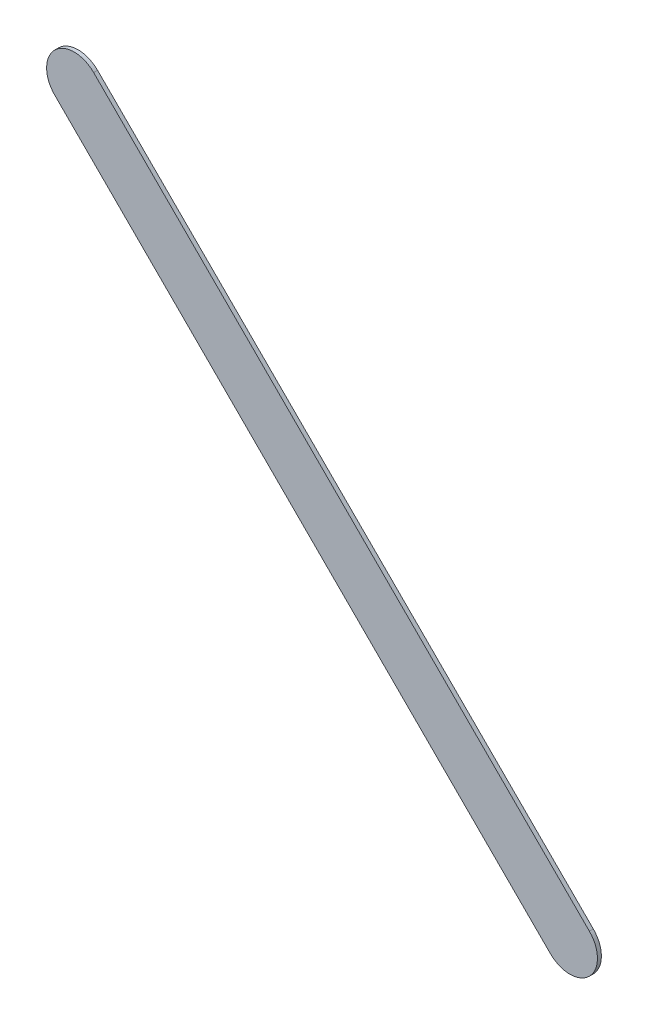
ISO-10303-21;
HEADER;
FILE_DESCRIPTION(('STEP AP214'),'2;1');
FILE_NAME('part.step','',(''),(''),'','','');
FILE_SCHEMA(('AUTOMOTIVE_DESIGN { 1 0 10303 214 1 1 1 1 }'));
ENDSEC;
DATA;
#1=APPLICATION_CONTEXT('core data for automotive mechanical design processes');
#2=APPLICATION_PROTOCOL_DEFINITION('international standard','automotive_design',2000,#1);
#3=PRODUCT_CONTEXT('',#1,'mechanical');
#4=PRODUCT('Part','Part','',(#3));
#5=PRODUCT_RELATED_PRODUCT_CATEGORY('part','',(#4));
#6=PRODUCT_DEFINITION_FORMATION('','',#4);
#7=PRODUCT_DEFINITION_CONTEXT('part definition',#1,'design');
#8=PRODUCT_DEFINITION('design','',#6,#7);
#9=PRODUCT_DEFINITION_SHAPE('','',#8);
#10=(LENGTH_UNIT() NAMED_UNIT(*) SI_UNIT(.MILLI.,.METRE.));
#11=(NAMED_UNIT(*) PLANE_ANGLE_UNIT() SI_UNIT($,.RADIAN.));
#12=(NAMED_UNIT(*) SI_UNIT($,.STERADIAN.) SOLID_ANGLE_UNIT());
#13=UNCERTAINTY_MEASURE_WITH_UNIT(LENGTH_MEASURE(1.E-05),#10,'distance_accuracy_value','');
#14=(GEOMETRIC_REPRESENTATION_CONTEXT(3) GLOBAL_UNCERTAINTY_ASSIGNED_CONTEXT((#13)) GLOBAL_UNIT_ASSIGNED_CONTEXT((#10,
#11,#12)) REPRESENTATION_CONTEXT('',''));
#15=CARTESIAN_POINT('',(0.,0.,0.));
#16=DIRECTION('',(0.,0.,1.));
#17=DIRECTION('',(1.,0.,0.));
#18=AXIS2_PLACEMENT_3D('',#15,#16,#17);
#19=CARTESIAN_POINT('',(45.72322326,77.75691078,0.));
#20=DIRECTION('',(0.707106781186549,0.707106781186546,0.));
#21=DIRECTION('',(0.707106781186546,-0.707106781186549,0.));
#22=AXIS2_PLACEMENT_3D('',#19,#20,#21);
#23=PLANE('',#22);
#24=DIRECTION('',(0.707106781186546,-0.707106781186549,0.));
#25=VECTOR('',#24,1.);
#26=CARTESIAN_POINT('',(45.72322326,77.75691078,0.03556));
#27=LINE('',#26,#25);
#28=CARTESIAN_POINT('',(45.72322326,77.75691078,0.03556));
#29=VERTEX_POINT('',#28);
#30=CARTESIAN_POINT('',(50.22322442,73.25690962,0.03556));
#31=VERTEX_POINT('',#30);
#32=EDGE_CURVE('E11',#29,#31,#27,.T.);
#33=ORIENTED_EDGE('',*,*,#32,.F.);
#34=DIRECTION('',(0.,0.,1.));
#35=VECTOR('',#34,1.);
#36=CARTESIAN_POINT('',(45.72322326,77.75691078,0.));
#37=LINE('',#36,#35);
#38=CARTESIAN_POINT('',(45.72322326,77.75691078,0.));
#39=VERTEX_POINT('',#38);
#40=EDGE_CURVE('E24',#39,#29,#37,.T.);
#41=ORIENTED_EDGE('',*,*,#40,.F.);
#42=DIRECTION('',(0.707106781186546,-0.707106781186549,0.));
#43=VECTOR('',#42,1.);
#44=CARTESIAN_POINT('',(45.72322326,77.75691078,0.));
#45=LINE('',#44,#43);
#46=CARTESIAN_POINT('',(50.22322442,73.25690962,0.));
#47=VERTEX_POINT('',#46);
#48=EDGE_CURVE('E75',#39,#47,#45,.T.);
#49=ORIENTED_EDGE('',*,*,#48,.T.);
#50=DIRECTION('',(0.,0.,1.));
#51=VECTOR('',#50,1.);
#52=CARTESIAN_POINT('',(50.22322442,73.25690962,0.));
#53=LINE('',#52,#51);
#54=EDGE_CURVE('E37',#47,#31,#53,.T.);
#55=ORIENTED_EDGE('',*,*,#54,.T.);
#56=EDGE_LOOP('',(#33,#41,#49,#55));
#57=FACE_BOUND('',#56,.T.);
#58=ADVANCED_FACE('F17',(#57),#23,.F.);
#59=CARTESIAN_POINT('',(50.4000008,73.433686,0.));
#60=DIRECTION('',(0.,0.,-1.));
#61=DIRECTION('',(-0.707106781186548,-0.707106781186548,0.));
#62=AXIS2_PLACEMENT_3D('',#59,#60,#61);
#63=CYLINDRICAL_SURFACE('',#62,0.249999554103226);
#64=CARTESIAN_POINT('',(50.4000008,73.433686,0.03556));
#65=DIRECTION('',(0.,0.,1.));
#66=DIRECTION('',(-0.707106781186548,-0.707106781186548,0.));
#67=AXIS2_PLACEMENT_3D('',#64,#65,#66);
#68=CIRCLE('',#67,0.249999554103226);
#69=CARTESIAN_POINT('',(50.57677718,73.61046238,0.03556));
#70=VERTEX_POINT('',#69);
#71=EDGE_CURVE('E83',#31,#70,#68,.T.);
#72=ORIENTED_EDGE('',*,*,#71,.F.);
#73=ORIENTED_EDGE('',*,*,#54,.F.);
#74=CARTESIAN_POINT('',(50.4000008,73.433686,0.));
#75=DIRECTION('',(0.,0.,1.));
#76=DIRECTION('',(-0.707106781186548,-0.707106781186548,0.));
#77=AXIS2_PLACEMENT_3D('',#74,#75,#76);
#78=CIRCLE('',#77,0.249999554103226);
#79=CARTESIAN_POINT('',(50.57677718,73.61046238,0.));
#80=VERTEX_POINT('',#79);
#81=EDGE_CURVE('E81',#47,#80,#78,.T.);
#82=ORIENTED_EDGE('',*,*,#81,.T.);
#83=DIRECTION('',(0.,0.,1.));
#84=VECTOR('',#83,1.);
#85=CARTESIAN_POINT('',(50.57677718,73.61046238,0.));
#86=LINE('',#85,#84);
#87=EDGE_CURVE('E67',#80,#70,#86,.T.);
#88=ORIENTED_EDGE('',*,*,#87,.T.);
#89=EDGE_LOOP('',(#72,#73,#82,#88));
#90=FACE_BOUND('',#89,.T.);
#91=ADVANCED_FACE('F89',(#90),#63,.T.);
#92=CARTESIAN_POINT('',(50.57677718,73.61046238,0.));
#93=DIRECTION('',(-0.707106781186547,-0.707106781186548,0.));
#94=DIRECTION('',(-0.707106781186548,0.707106781186547,0.));
#95=AXIS2_PLACEMENT_3D('',#92,#93,#94);
#96=PLANE('',#95);
#97=DIRECTION('',(-0.707106781186548,0.707106781186547,0.));
#98=VECTOR('',#97,1.);
#99=CARTESIAN_POINT('',(50.57677718,73.61046238,0.03556));
#100=LINE('',#99,#98);
#101=CARTESIAN_POINT('',(46.07677602,78.11046354,0.03556));
#102=VERTEX_POINT('',#101);
#103=EDGE_CURVE('E71',#70,#102,#100,.T.);
#104=ORIENTED_EDGE('',*,*,#103,.F.);
#105=ORIENTED_EDGE('',*,*,#87,.F.);
#106=DIRECTION('',(-0.707106781186548,0.707106781186547,0.));
#107=VECTOR('',#106,1.);
#108=CARTESIAN_POINT('',(50.57677718,73.61046238,0.));
#109=LINE('',#108,#107);
#110=CARTESIAN_POINT('',(46.07677602,78.11046354,0.));
#111=VERTEX_POINT('',#110);
#112=EDGE_CURVE('E63',#80,#111,#109,.T.);
#113=ORIENTED_EDGE('',*,*,#112,.T.);
#114=DIRECTION('',(0.,0.,1.));
#115=VECTOR('',#114,1.);
#116=CARTESIAN_POINT('',(46.07677602,78.11046354,0.));
#117=LINE('',#116,#115);
#118=EDGE_CURVE('E53',#111,#102,#117,.T.);
#119=ORIENTED_EDGE('',*,*,#118,.T.);
#120=EDGE_LOOP('',(#104,#105,#113,#119));
#121=FACE_BOUND('',#120,.T.);
#122=ADVANCED_FACE('F66',(#121),#96,.F.);
#123=CARTESIAN_POINT('',(45.89999964,77.93368716,0.));
#124=DIRECTION('',(0.,0.,-1.));
#125=DIRECTION('',(0.707106781186562,0.707106781186533,0.));
#126=AXIS2_PLACEMENT_3D('',#123,#124,#125);
#127=CYLINDRICAL_SURFACE('',#126,0.249999554103218);
#128=CARTESIAN_POINT('',(45.89999964,77.93368716,0.03556));
#129=DIRECTION('',(0.,0.,1.));
#130=DIRECTION('',(0.707106781186562,0.707106781186533,0.));
#131=AXIS2_PLACEMENT_3D('',#128,#129,#130);
#132=CIRCLE('',#131,0.249999554103218);
#133=EDGE_CURVE('E59',#102,#29,#132,.T.);
#134=ORIENTED_EDGE('',*,*,#133,.F.);
#135=ORIENTED_EDGE('',*,*,#118,.F.);
#136=CARTESIAN_POINT('',(45.89999964,77.93368716,0.));
#137=DIRECTION('',(0.,0.,1.));
#138=DIRECTION('',(0.707106781186562,0.707106781186533,0.));
#139=AXIS2_PLACEMENT_3D('',#136,#137,#138);
#140=CIRCLE('',#139,0.249999554103218);
#141=EDGE_CURVE('E57',#111,#39,#140,.T.);
#142=ORIENTED_EDGE('',*,*,#141,.T.);
#143=ORIENTED_EDGE('',*,*,#40,.T.);
#144=EDGE_LOOP('',(#134,#135,#142,#143));
#145=FACE_BOUND('',#144,.T.);
#146=ADVANCED_FACE('F55',(#145),#127,.T.);
#147=CARTESIAN_POINT('',(45.72322326,77.75691078,0.));
#148=DIRECTION('',(0.,0.,-1.));
#149=DIRECTION('',(-1.,0.,0.));
#150=AXIS2_PLACEMENT_3D('',#147,#148,#149);
#151=PLANE('',#150);
#152=ORIENTED_EDGE('',*,*,#141,.F.);
#153=ORIENTED_EDGE('',*,*,#112,.F.);
#154=ORIENTED_EDGE('',*,*,#81,.F.);
#155=ORIENTED_EDGE('',*,*,#48,.F.);
#156=EDGE_LOOP('',(#152,#153,#154,#155));
#157=FACE_BOUND('',#156,.T.);
#158=ADVANCED_FACE('F74',(#157),#151,.T.);
#159=CARTESIAN_POINT('',(45.72322326,77.75691078,0.03556));
#160=DIRECTION('',(0.,0.,-1.));
#161=DIRECTION('',(-1.,0.,0.));
#162=AXIS2_PLACEMENT_3D('',#159,#160,#161);
#163=PLANE('',#162);
#164=ORIENTED_EDGE('',*,*,#32,.T.);
#165=ORIENTED_EDGE('',*,*,#71,.T.);
#166=ORIENTED_EDGE('',*,*,#103,.T.);
#167=ORIENTED_EDGE('',*,*,#133,.T.);
#168=EDGE_LOOP('',(#164,#165,#166,#167));
#169=FACE_BOUND('',#168,.T.);
#170=ADVANCED_FACE('F91',(#169),#163,.F.);
#171=CLOSED_SHELL('',(#58,#91,#122,#146,#158,#170));
#172=MANIFOLD_SOLID_BREP('B1',#171);
#173=ADVANCED_BREP_SHAPE_REPRESENTATION('',(#18,#172),#14);
#174=SHAPE_DEFINITION_REPRESENTATION(#9,#173);
ENDSEC;
END-ISO-10303-21;
